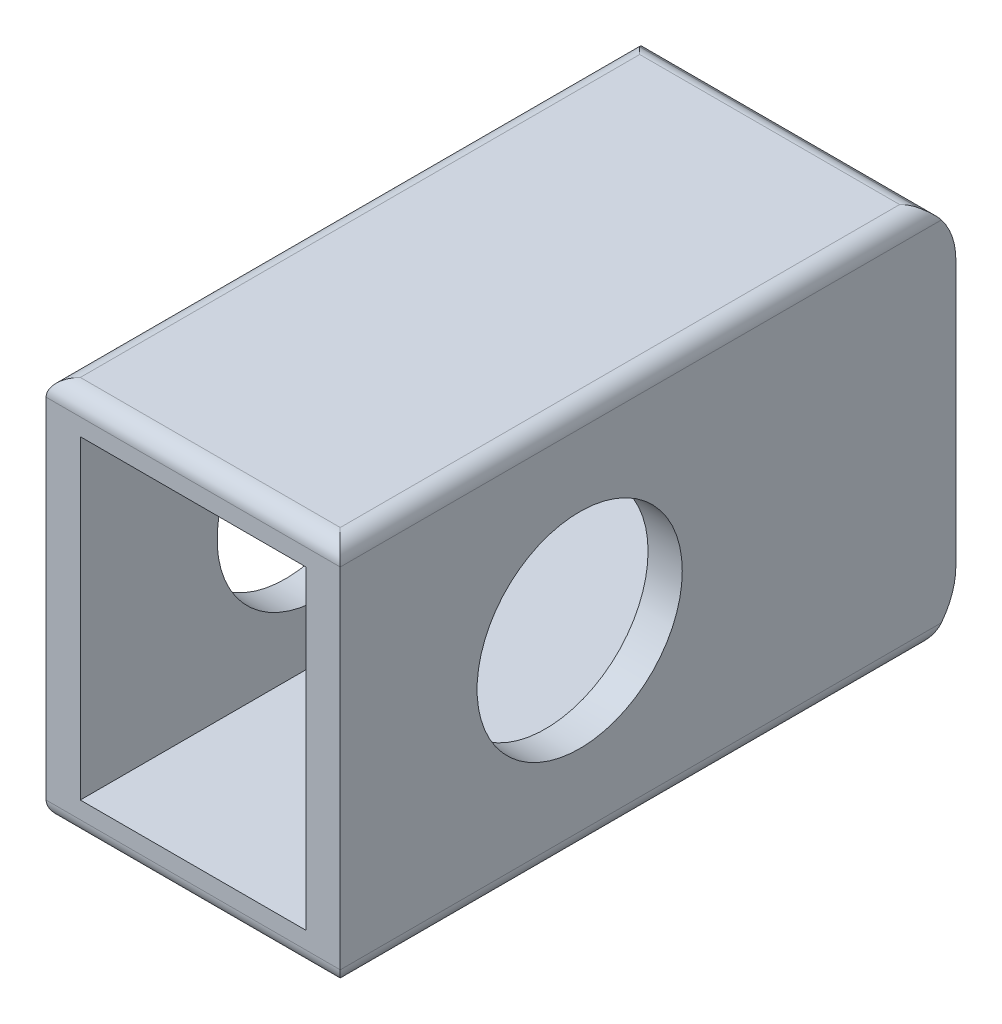
ISO-10303-21;
HEADER;
FILE_DESCRIPTION(('STEP AP214'),'2;1');
FILE_NAME('part.step','',(''),(''),'','','');
FILE_SCHEMA(('AUTOMOTIVE_DESIGN { 1 0 10303 214 1 1 1 1 }'));
ENDSEC;
DATA;
#1=APPLICATION_CONTEXT('core data for automotive mechanical design processes');
#2=APPLICATION_PROTOCOL_DEFINITION('international standard','automotive_design',2000,#1);
#3=PRODUCT_CONTEXT('',#1,'mechanical');
#4=PRODUCT('Part','Part','',(#3));
#5=PRODUCT_RELATED_PRODUCT_CATEGORY('part','',(#4));
#6=PRODUCT_DEFINITION_FORMATION('','',#4);
#7=PRODUCT_DEFINITION_CONTEXT('part definition',#1,'design');
#8=PRODUCT_DEFINITION('design','',#6,#7);
#9=PRODUCT_DEFINITION_SHAPE('','',#8);
#10=(LENGTH_UNIT() NAMED_UNIT(*) SI_UNIT(.MILLI.,.METRE.));
#11=(NAMED_UNIT(*) PLANE_ANGLE_UNIT() SI_UNIT($,.RADIAN.));
#12=(NAMED_UNIT(*) SI_UNIT($,.STERADIAN.) SOLID_ANGLE_UNIT());
#13=UNCERTAINTY_MEASURE_WITH_UNIT(LENGTH_MEASURE(1.E-05),#10,'distance_accuracy_value','');
#14=(GEOMETRIC_REPRESENTATION_CONTEXT(3) GLOBAL_UNCERTAINTY_ASSIGNED_CONTEXT((#13)) GLOBAL_UNIT_ASSIGNED_CONTEXT((#10,
#11,#12)) REPRESENTATION_CONTEXT('',''));
#15=CARTESIAN_POINT('',(0.,0.,0.));
#16=DIRECTION('',(0.,0.,1.));
#17=DIRECTION('',(1.,0.,0.));
#18=AXIS2_PLACEMENT_3D('',#15,#16,#17);
#19=CARTESIAN_POINT('',(-4.76811277750695,-7.26370150570095,18.));
#20=DIRECTION('',(1.,0.,0.));
#21=DIRECTION('',(0.,0.,-1.));
#22=AXIS2_PLACEMENT_3D('',#19,#20,#21);
#23=PLANE('',#22);
#24=CARTESIAN_POINT('',(-4.76811277750695,-1.66370150570095,11.));
#25=DIRECTION('',(1.,0.,0.));
#26=DIRECTION('',(0.,0.,-1.));
#27=AXIS2_PLACEMENT_3D('',#24,#25,#26);
#28=CIRCLE('',#27,3.);
#29=CARTESIAN_POINT('',(-4.76811277750695,-1.66370150570095,8.));
#30=VERTEX_POINT('',#29);
#31=EDGE_CURVE('E464',#30,#30,#28,.T.);
#32=ORIENTED_EDGE('',*,*,#31,.T.);
#33=EDGE_LOOP('',(#32));
#34=FACE_BOUND('',#33,.T.);
#35=CARTESIAN_POINT('',(-4.76811277750695,-5.53165069813207,2.));
#36=DIRECTION('',(1.,0.,0.));
#37=DIRECTION('',(0.,0.,-1.));
#38=AXIS2_PLACEMENT_3D('',#35,#36,#37);
#39=CIRCLE('',#38,2.);
#40=CARTESIAN_POINT('',(-4.76811277750695,-5.53165069813207,0.));
#41=VERTEX_POINT('',#40);
#42=CARTESIAN_POINT('',(-4.76811277750695,-6.76370150570095,0.424547427699308));
#43=VERTEX_POINT('',#42);
#44=EDGE_CURVE('E163',#41,#43,#39,.F.);
#45=ORIENTED_EDGE('',*,*,#44,.T.);
#46=DIRECTION('',(0.,0.,-1.));
#47=VECTOR('',#46,1.);
#48=CARTESIAN_POINT('',(-4.76811277750695,-6.76370150570095,18.));
#49=LINE('',#48,#47);
#50=CARTESIAN_POINT('',(-4.76811277750695,-6.76370150570095,18.));
#51=VERTEX_POINT('',#50);
#52=EDGE_CURVE('E450',#43,#51,#49,.F.);
#53=ORIENTED_EDGE('',*,*,#52,.T.);
#54=DIRECTION('',(0.,-1.,0.));
#55=VECTOR('',#54,1.);
#56=CARTESIAN_POINT('',(-4.76811277750695,-7.26370150570095,18.));
#57=LINE('',#56,#55);
#58=CARTESIAN_POINT('',(-4.76811277750695,3.43629849429905,18.));
#59=VERTEX_POINT('',#58);
#60=EDGE_CURVE('E187',#59,#51,#57,.T.);
#61=ORIENTED_EDGE('',*,*,#60,.F.);
#62=DIRECTION('',(0.,0.,-1.));
#63=VECTOR('',#62,1.);
#64=CARTESIAN_POINT('',(-4.76811277750695,3.43629849429905,18.));
#65=LINE('',#64,#63);
#66=CARTESIAN_POINT('',(-4.76811277750695,3.43629849429905,0.424547427699308));
#67=VERTEX_POINT('',#66);
#68=EDGE_CURVE('E263',#59,#67,#65,.T.);
#69=ORIENTED_EDGE('',*,*,#68,.T.);
#70=CARTESIAN_POINT('',(-4.76811277750695,2.20424768673017,2.));
#71=DIRECTION('',(1.,0.,0.));
#72=DIRECTION('',(0.,0.,-1.));
#73=AXIS2_PLACEMENT_3D('',#70,#71,#72);
#74=CIRCLE('',#73,2.);
#75=CARTESIAN_POINT('',(-4.76811277750695,2.20424768673017,0.));
#76=VERTEX_POINT('',#75);
#77=EDGE_CURVE('E328',#76,#67,#74,.T.);
#78=ORIENTED_EDGE('',*,*,#77,.F.);
#79=DIRECTION('',(0.,-1.,0.));
#80=VECTOR('',#79,1.);
#81=CARTESIAN_POINT('',(-4.76811277750695,-7.26370150570095,0.));
#82=LINE('',#81,#80);
#83=EDGE_CURVE('E188',#76,#41,#82,.T.);
#84=ORIENTED_EDGE('',*,*,#83,.T.);
#85=EDGE_LOOP('',(#45,#53,#61,#69,#78,#84));
#86=FACE_BOUND('',#85,.T.);
#87=ADVANCED_FACE('F42',(#34,#86),#23,.F.);
#88=CARTESIAN_POINT('',(3.83188722249305,-7.26370150570095,18.));
#89=DIRECTION('',(-1.,0.,0.));
#90=DIRECTION('',(0.,0.,1.));
#91=AXIS2_PLACEMENT_3D('',#88,#89,#90);
#92=PLANE('',#91);
#93=CARTESIAN_POINT('',(3.83188722249305,-1.66370150570095,11.));
#94=DIRECTION('',(1.,0.,0.));
#95=DIRECTION('',(0.,0.,-1.));
#96=AXIS2_PLACEMENT_3D('',#93,#94,#95);
#97=CIRCLE('',#96,3.);
#98=CARTESIAN_POINT('',(3.83188722249305,-1.66370150570095,8.));
#99=VERTEX_POINT('',#98);
#100=EDGE_CURVE('E182',#99,#99,#97,.T.);
#101=ORIENTED_EDGE('',*,*,#100,.F.);
#102=EDGE_LOOP('',(#101));
#103=FACE_BOUND('',#102,.T.);
#104=DIRECTION('',(0.,1.,0.));
#105=VECTOR('',#104,1.);
#106=CARTESIAN_POINT('',(3.83188722249305,-7.26370150570095,18.));
#107=LINE('',#106,#105);
#108=CARTESIAN_POINT('',(3.83188722249305,-6.76370150570095,18.));
#109=VERTEX_POINT('',#108);
#110=CARTESIAN_POINT('',(3.83188722249305,3.43629849429905,18.));
#111=VERTEX_POINT('',#110);
#112=EDGE_CURVE('E170',#109,#111,#107,.T.);
#113=ORIENTED_EDGE('',*,*,#112,.F.);
#114=DIRECTION('',(0.,0.,-1.));
#115=VECTOR('',#114,1.);
#116=CARTESIAN_POINT('',(3.83188722249305,-6.76370150570095,18.));
#117=LINE('',#116,#115);
#118=CARTESIAN_POINT('',(3.83188722249305,-6.76370150570095,0.424547427699308));
#119=VERTEX_POINT('',#118);
#120=EDGE_CURVE('E179',#109,#119,#117,.T.);
#121=ORIENTED_EDGE('',*,*,#120,.T.);
#122=CARTESIAN_POINT('',(3.83188722249305,-5.53165069813207,2.));
#123=DIRECTION('',(1.,0.,0.));
#124=DIRECTION('',(0.,0.,-1.));
#125=AXIS2_PLACEMENT_3D('',#122,#123,#124);
#126=CIRCLE('',#125,2.);
#127=CARTESIAN_POINT('',(3.83188722249305,-5.53165069813207,0.));
#128=VERTEX_POINT('',#127);
#129=EDGE_CURVE('E160',#128,#119,#126,.F.);
#130=ORIENTED_EDGE('',*,*,#129,.F.);
#131=DIRECTION('',(0.,1.,0.));
#132=VECTOR('',#131,1.);
#133=CARTESIAN_POINT('',(3.83188722249305,-7.26370150570095,0.));
#134=LINE('',#133,#132);
#135=CARTESIAN_POINT('',(3.83188722249305,2.20424768673017,0.));
#136=VERTEX_POINT('',#135);
#137=EDGE_CURVE('E177',#128,#136,#134,.T.);
#138=ORIENTED_EDGE('',*,*,#137,.T.);
#139=CARTESIAN_POINT('',(3.83188722249305,2.20424768673017,2.));
#140=DIRECTION('',(1.,0.,0.));
#141=DIRECTION('',(0.,0.,-1.));
#142=AXIS2_PLACEMENT_3D('',#139,#140,#141);
#143=CIRCLE('',#142,2.);
#144=CARTESIAN_POINT('',(3.83188722249305,3.43629849429905,0.424547427699308));
#145=VERTEX_POINT('',#144);
#146=EDGE_CURVE('E181',#136,#145,#143,.T.);
#147=ORIENTED_EDGE('',*,*,#146,.T.);
#148=DIRECTION('',(0.,0.,-1.));
#149=VECTOR('',#148,1.);
#150=CARTESIAN_POINT('',(3.83188722249305,3.43629849429905,18.));
#151=LINE('',#150,#149);
#152=EDGE_CURVE('E225',#145,#111,#151,.F.);
#153=ORIENTED_EDGE('',*,*,#152,.T.);
#154=EDGE_LOOP('',(#113,#121,#130,#138,#147,#153));
#155=FACE_BOUND('',#154,.T.);
#156=ADVANCED_FACE('F175',(#103,#155),#92,.F.);
#157=CARTESIAN_POINT('',(-4.76811277750695,3.93629849429905,18.));
#158=DIRECTION('',(0.,-1.,0.));
#159=DIRECTION('',(0.,0.,-1.));
#160=AXIS2_PLACEMENT_3D('',#157,#158,#159);
#161=PLANE('',#160);
#162=DIRECTION('',(-1.,0.,0.));
#163=VECTOR('',#162,1.);
#164=CARTESIAN_POINT('',(-4.76811277750695,3.93629849429905,17.5));
#165=LINE('',#164,#163);
#166=CARTESIAN_POINT('',(-4.26811277750695,3.93629849429905,17.5));
#167=VERTEX_POINT('',#166);
#168=CARTESIAN_POINT('',(3.33188722249305,3.93629849429905,17.5));
#169=VERTEX_POINT('',#168);
#170=EDGE_CURVE('E390',#167,#169,#165,.F.);
#171=ORIENTED_EDGE('',*,*,#170,.T.);
#172=DIRECTION('',(0.,0.,-1.));
#173=VECTOR('',#172,1.);
#174=CARTESIAN_POINT('',(3.33188722249305,3.93629849429905,18.));
#175=LINE('',#174,#173);
#176=CARTESIAN_POINT('',(3.33188722249305,3.93629849429905,1.14440032283265));
#177=VERTEX_POINT('',#176);
#178=EDGE_CURVE('E380',#169,#177,#175,.T.);
#179=ORIENTED_EDGE('',*,*,#178,.T.);
#180=DIRECTION('',(-1.,0.,0.));
#181=VECTOR('',#180,1.);
#182=CARTESIAN_POINT('',(-4.76811277750695,3.93629849429905,1.14440032283265));
#183=LINE('',#182,#181);
#184=CARTESIAN_POINT('',(-4.26811277750695,3.93629849429905,1.14440032283265));
#185=VERTEX_POINT('',#184);
#186=EDGE_CURVE('E448',#177,#185,#183,.T.);
#187=ORIENTED_EDGE('',*,*,#186,.T.);
#188=DIRECTION('',(0.,0.,-1.));
#189=VECTOR('',#188,1.);
#190=CARTESIAN_POINT('',(-4.26811277750695,3.93629849429905,18.));
#191=LINE('',#190,#189);
#192=EDGE_CURVE('E445',#185,#167,#191,.F.);
#193=ORIENTED_EDGE('',*,*,#192,.T.);
#194=EDGE_LOOP('',(#171,#179,#187,#193));
#195=FACE_BOUND('',#194,.T.);
#196=ADVANCED_FACE('F285',(#195),#161,.F.);
#197=CARTESIAN_POINT('',(0.,0.,0.));
#198=DIRECTION('',(0.,0.,-1.));
#199=DIRECTION('',(-1.,0.,0.));
#200=AXIS2_PLACEMENT_3D('',#197,#198,#199);
#201=PLANE('',#200);
#202=ORIENTED_EDGE('',*,*,#83,.F.);
#203=DIRECTION('',(1.,0.,0.));
#204=VECTOR('',#203,1.);
#205=CARTESIAN_POINT('',(-16.1681127775069,2.20424768673017,0.));
#206=LINE('',#205,#204);
#207=EDGE_CURVE('E169',#76,#136,#206,.T.);
#208=ORIENTED_EDGE('',*,*,#207,.T.);
#209=ORIENTED_EDGE('',*,*,#137,.F.);
#210=DIRECTION('',(1.,0.,0.));
#211=VECTOR('',#210,1.);
#212=CARTESIAN_POINT('',(-16.1681127775069,-5.53165069813207,0.));
#213=LINE('',#212,#211);
#214=EDGE_CURVE('E157',#128,#41,#213,.F.);
#215=ORIENTED_EDGE('',*,*,#214,.T.);
#216=EDGE_LOOP('',(#202,#208,#209,#215));
#217=FACE_BOUND('',#216,.T.);
#218=ADVANCED_FACE('F185',(#217),#201,.T.);
#219=CARTESIAN_POINT('',(0.,0.,18.));
#220=DIRECTION('',(0.,0.,-1.));
#221=DIRECTION('',(-1.,0.,0.));
#222=AXIS2_PLACEMENT_3D('',#219,#220,#221);
#223=PLANE('',#222);
#224=ORIENTED_EDGE('',*,*,#60,.T.);
#225=DIRECTION('',(1.,0.,0.));
#226=VECTOR('',#225,1.);
#227=CARTESIAN_POINT('',(0.,-6.76370150570095,18.));
#228=LINE('',#227,#226);
#229=EDGE_CURVE('E208',#51,#109,#228,.T.);
#230=ORIENTED_EDGE('',*,*,#229,.T.);
#231=ORIENTED_EDGE('',*,*,#112,.T.);
#232=DIRECTION('',(-1.,0.,0.));
#233=VECTOR('',#232,1.);
#234=CARTESIAN_POINT('',(0.,3.43629849429905,18.));
#235=LINE('',#234,#233);
#236=EDGE_CURVE('E205',#111,#59,#235,.T.);
#237=ORIENTED_EDGE('',*,*,#236,.T.);
#238=EDGE_LOOP('',(#224,#230,#231,#237));
#239=FACE_BOUND('',#238,.T.);
#240=DIRECTION('',(0.,-1.,0.));
#241=VECTOR('',#240,1.);
#242=CARTESIAN_POINT('',(-3.76811277750695,0.,18.));
#243=LINE('',#242,#241);
#244=CARTESIAN_POINT('',(-3.76811277750695,2.93629849429905,18.));
#245=VERTEX_POINT('',#244);
#246=CARTESIAN_POINT('',(-3.76811277750695,-6.26370150570095,18.));
#247=VERTEX_POINT('',#246);
#248=EDGE_CURVE('E355',#245,#247,#243,.T.);
#249=ORIENTED_EDGE('',*,*,#248,.F.);
#250=DIRECTION('',(-1.,0.,0.));
#251=VECTOR('',#250,1.);
#252=CARTESIAN_POINT('',(0.,2.93629849429905,18.));
#253=LINE('',#252,#251);
#254=CARTESIAN_POINT('',(2.83188722249305,2.93629849429905,18.));
#255=VERTEX_POINT('',#254);
#256=EDGE_CURVE('E342',#255,#245,#253,.T.);
#257=ORIENTED_EDGE('',*,*,#256,.F.);
#258=DIRECTION('',(0.,1.,0.));
#259=VECTOR('',#258,1.);
#260=CARTESIAN_POINT('',(2.83188722249305,0.,18.));
#261=LINE('',#260,#259);
#262=CARTESIAN_POINT('',(2.83188722249305,-6.26370150570095,18.));
#263=VERTEX_POINT('',#262);
#264=EDGE_CURVE('E361',#263,#255,#261,.T.);
#265=ORIENTED_EDGE('',*,*,#264,.F.);
#266=DIRECTION('',(1.,0.,0.));
#267=VECTOR('',#266,1.);
#268=CARTESIAN_POINT('',(0.,-6.26370150570095,18.));
#269=LINE('',#268,#267);
#270=EDGE_CURVE('E358',#247,#263,#269,.T.);
#271=ORIENTED_EDGE('',*,*,#270,.F.);
#272=EDGE_LOOP('',(#249,#257,#265,#271));
#273=FACE_BOUND('',#272,.T.);
#274=ADVANCED_FACE('F281',(#239,#273),#223,.F.);
#275=CARTESIAN_POINT('',(-4.76811277750695,-7.26370150570095,18.));
#276=DIRECTION('',(0.,1.,0.));
#277=DIRECTION('',(0.,0.,1.));
#278=AXIS2_PLACEMENT_3D('',#275,#276,#277);
#279=PLANE('',#278);
#280=DIRECTION('',(0.,0.,-1.));
#281=VECTOR('',#280,1.);
#282=CARTESIAN_POINT('',(3.33188722249305,-7.26370150570095,18.));
#283=LINE('',#282,#281);
#284=CARTESIAN_POINT('',(3.33188722249305,-7.26370150570095,1.14440032283265));
#285=VERTEX_POINT('',#284);
#286=CARTESIAN_POINT('',(3.33188722249305,-7.26370150570095,17.5));
#287=VERTEX_POINT('',#286);
#288=EDGE_CURVE('E218',#285,#287,#283,.F.);
#289=ORIENTED_EDGE('',*,*,#288,.T.);
#290=DIRECTION('',(1.,0.,0.));
#291=VECTOR('',#290,1.);
#292=CARTESIAN_POINT('',(-4.76811277750695,-7.26370150570095,17.5));
#293=LINE('',#292,#291);
#294=CARTESIAN_POINT('',(-4.26811277750695,-7.26370150570095,17.5));
#295=VERTEX_POINT('',#294);
#296=EDGE_CURVE('E221',#287,#295,#293,.F.);
#297=ORIENTED_EDGE('',*,*,#296,.T.);
#298=DIRECTION('',(0.,0.,-1.));
#299=VECTOR('',#298,1.);
#300=CARTESIAN_POINT('',(-4.26811277750695,-7.26370150570095,18.));
#301=LINE('',#300,#299);
#302=CARTESIAN_POINT('',(-4.26811277750695,-7.26370150570095,1.14440032283265));
#303=VERTEX_POINT('',#302);
#304=EDGE_CURVE('E212',#295,#303,#301,.T.);
#305=ORIENTED_EDGE('',*,*,#304,.T.);
#306=DIRECTION('',(1.,0.,0.));
#307=VECTOR('',#306,1.);
#308=CARTESIAN_POINT('',(-4.76811277750695,-7.26370150570095,1.14440032283265));
#309=LINE('',#308,#307);
#310=EDGE_CURVE('E215',#303,#285,#309,.T.);
#311=ORIENTED_EDGE('',*,*,#310,.T.);
#312=EDGE_LOOP('',(#289,#297,#305,#311));
#313=FACE_BOUND('',#312,.T.);
#314=ADVANCED_FACE('F277',(#313),#279,.F.);
#315=CARTESIAN_POINT('',(-3.76811277750695,-7.26370150570095,18.));
#316=DIRECTION('',(1.,0.,0.));
#317=DIRECTION('',(0.,0.,-1.));
#318=AXIS2_PLACEMENT_3D('',#315,#316,#317);
#319=PLANE('',#318);
#320=CARTESIAN_POINT('',(-3.76811277750695,-1.66370150570095,11.));
#321=DIRECTION('',(1.,0.,0.));
#322=DIRECTION('',(0.,0.,-1.));
#323=AXIS2_PLACEMENT_3D('',#320,#321,#322);
#324=CIRCLE('',#323,3.);
#325=CARTESIAN_POINT('',(-3.76811277750695,-1.66370150570095,8.));
#326=VERTEX_POINT('',#325);
#327=EDGE_CURVE('E201',#326,#326,#324,.T.);
#328=ORIENTED_EDGE('',*,*,#327,.F.);
#329=EDGE_LOOP('',(#328));
#330=FACE_BOUND('',#329,.T.);
#331=DIRECTION('',(0.,-1.,0.));
#332=VECTOR('',#331,1.);
#333=CARTESIAN_POINT('',(-3.76811277750695,0.,1.));
#334=LINE('',#333,#332);
#335=CARTESIAN_POINT('',(-3.76811277750695,2.93629849429905,1.));
#336=VERTEX_POINT('',#335);
#337=CARTESIAN_POINT('',(-3.76811277750695,-6.26370150570095,1.));
#338=VERTEX_POINT('',#337);
#339=EDGE_CURVE('E321',#336,#338,#334,.T.);
#340=ORIENTED_EDGE('',*,*,#339,.F.);
#341=DIRECTION('',(0.,0.,-1.));
#342=VECTOR('',#341,1.);
#343=CARTESIAN_POINT('',(-3.76811277750695,2.93629849429905,18.));
#344=LINE('',#343,#342);
#345=EDGE_CURVE('E323',#245,#336,#344,.T.);
#346=ORIENTED_EDGE('',*,*,#345,.F.);
#347=ORIENTED_EDGE('',*,*,#248,.T.);
#348=DIRECTION('',(0.,0.,-1.));
#349=VECTOR('',#348,1.);
#350=CARTESIAN_POINT('',(-3.76811277750695,-6.26370150570095,18.));
#351=LINE('',#350,#349);
#352=EDGE_CURVE('E194',#247,#338,#351,.T.);
#353=ORIENTED_EDGE('',*,*,#352,.T.);
#354=EDGE_LOOP('',(#340,#346,#347,#353));
#355=FACE_BOUND('',#354,.T.);
#356=ADVANCED_FACE('F280',(#330,#355),#319,.T.);
#357=CARTESIAN_POINT('',(-4.76811277750695,-6.26370150570095,18.));
#358=DIRECTION('',(0.,1.,0.));
#359=DIRECTION('',(0.,0.,1.));
#360=AXIS2_PLACEMENT_3D('',#357,#358,#359);
#361=PLANE('',#360);
#362=DIRECTION('',(1.,0.,0.));
#363=VECTOR('',#362,1.);
#364=CARTESIAN_POINT('',(0.,-6.26370150570095,1.));
#365=LINE('',#364,#363);
#366=CARTESIAN_POINT('',(2.83188722249305,-6.26370150570095,1.));
#367=VERTEX_POINT('',#366);
#368=EDGE_CURVE('E327',#338,#367,#365,.T.);
#369=ORIENTED_EDGE('',*,*,#368,.F.);
#370=ORIENTED_EDGE('',*,*,#352,.F.);
#371=ORIENTED_EDGE('',*,*,#270,.T.);
#372=DIRECTION('',(0.,0.,-1.));
#373=VECTOR('',#372,1.);
#374=CARTESIAN_POINT('',(2.83188722249305,-6.26370150570095,18.));
#375=LINE('',#374,#373);
#376=EDGE_CURVE('E339',#263,#367,#375,.T.);
#377=ORIENTED_EDGE('',*,*,#376,.T.);
#378=EDGE_LOOP('',(#369,#370,#371,#377));
#379=FACE_BOUND('',#378,.T.);
#380=ADVANCED_FACE('F306',(#379),#361,.T.);
#381=CARTESIAN_POINT('',(2.83188722249305,-7.26370150570095,18.));
#382=DIRECTION('',(-1.,0.,0.));
#383=DIRECTION('',(0.,0.,1.));
#384=AXIS2_PLACEMENT_3D('',#381,#382,#383);
#385=PLANE('',#384);
#386=CARTESIAN_POINT('',(2.83188722249305,-1.66370150570095,11.));
#387=DIRECTION('',(-1.,0.,0.));
#388=DIRECTION('',(0.,0.,1.));
#389=AXIS2_PLACEMENT_3D('',#386,#387,#388);
#390=CIRCLE('',#389,3.);
#391=CARTESIAN_POINT('',(2.83188722249305,-1.66370150570095,14.));
#392=VERTEX_POINT('',#391);
#393=EDGE_CURVE('E198',#392,#392,#390,.T.);
#394=ORIENTED_EDGE('',*,*,#393,.F.);
#395=EDGE_LOOP('',(#394));
#396=FACE_BOUND('',#395,.T.);
#397=DIRECTION('',(0.,1.,0.));
#398=VECTOR('',#397,1.);
#399=CARTESIAN_POINT('',(2.83188722249305,0.,1.));
#400=LINE('',#399,#398);
#401=CARTESIAN_POINT('',(2.83188722249305,2.93629849429905,1.));
#402=VERTEX_POINT('',#401);
#403=EDGE_CURVE('E332',#367,#402,#400,.T.);
#404=ORIENTED_EDGE('',*,*,#403,.F.);
#405=ORIENTED_EDGE('',*,*,#376,.F.);
#406=ORIENTED_EDGE('',*,*,#264,.T.);
#407=DIRECTION('',(0.,0.,-1.));
#408=VECTOR('',#407,1.);
#409=CARTESIAN_POINT('',(2.83188722249305,2.93629849429905,18.));
#410=LINE('',#409,#408);
#411=EDGE_CURVE('E341',#255,#402,#410,.T.);
#412=ORIENTED_EDGE('',*,*,#411,.T.);
#413=EDGE_LOOP('',(#404,#405,#406,#412));
#414=FACE_BOUND('',#413,.T.);
#415=ADVANCED_FACE('F302',(#396,#414),#385,.T.);
#416=CARTESIAN_POINT('',(-4.76811277750695,2.93629849429905,18.));
#417=DIRECTION('',(0.,-1.,0.));
#418=DIRECTION('',(0.,0.,-1.));
#419=AXIS2_PLACEMENT_3D('',#416,#417,#418);
#420=PLANE('',#419);
#421=DIRECTION('',(-1.,0.,0.));
#422=VECTOR('',#421,1.);
#423=CARTESIAN_POINT('',(0.,2.93629849429905,1.));
#424=LINE('',#423,#422);
#425=EDGE_CURVE('E349',#402,#336,#424,.T.);
#426=ORIENTED_EDGE('',*,*,#425,.F.);
#427=ORIENTED_EDGE('',*,*,#411,.F.);
#428=ORIENTED_EDGE('',*,*,#256,.T.);
#429=ORIENTED_EDGE('',*,*,#345,.T.);
#430=EDGE_LOOP('',(#426,#427,#428,#429));
#431=FACE_BOUND('',#430,.T.);
#432=ADVANCED_FACE('F298',(#431),#420,.T.);
#433=CARTESIAN_POINT('',(0.,0.,1.));
#434=DIRECTION('',(0.,0.,-1.));
#435=DIRECTION('',(-1.,0.,0.));
#436=AXIS2_PLACEMENT_3D('',#433,#434,#435);
#437=PLANE('',#436);
#438=ORIENTED_EDGE('',*,*,#339,.T.);
#439=ORIENTED_EDGE('',*,*,#368,.T.);
#440=ORIENTED_EDGE('',*,*,#403,.T.);
#441=ORIENTED_EDGE('',*,*,#425,.T.);
#442=EDGE_LOOP('',(#438,#439,#440,#441));
#443=FACE_BOUND('',#442,.T.);
#444=ADVANCED_FACE('F295',(#443),#437,.F.);
#445=CARTESIAN_POINT('',(-16.1681127775069,-1.66370150570095,11.));
#446=DIRECTION('',(1.,0.,0.));
#447=DIRECTION('',(0.,0.,-1.));
#448=AXIS2_PLACEMENT_3D('',#445,#446,#447);
#449=CYLINDRICAL_SURFACE('',#448,3.);
#450=ORIENTED_EDGE('',*,*,#393,.T.);
#451=EDGE_LOOP('',(#450));
#452=FACE_BOUND('',#451,.T.);
#453=ORIENTED_EDGE('',*,*,#100,.T.);
#454=EDGE_LOOP('',(#453));
#455=FACE_BOUND('',#454,.T.);
#456=ADVANCED_FACE('F253',(#452,#455),#449,.F.);
#457=ORIENTED_EDGE('',*,*,#327,.T.);
#458=EDGE_LOOP('',(#457));
#459=FACE_BOUND('',#458,.T.);
#460=ORIENTED_EDGE('',*,*,#31,.F.);
#461=EDGE_LOOP('',(#460));
#462=FACE_BOUND('',#461,.T.);
#463=ADVANCED_FACE('F251',(#459,#462),#449,.F.);
#464=CARTESIAN_POINT('',(-16.1681127775069,-5.53165069813207,2.));
#465=DIRECTION('',(1.,0.,0.));
#466=DIRECTION('',(0.,0.,-1.));
#467=AXIS2_PLACEMENT_3D('',#464,#465,#466);
#468=CYLINDRICAL_SURFACE('',#467,2.);
#469=ORIENTED_EDGE('',*,*,#129,.T.);
#470=CARTESIAN_POINT('',(3.83188722249305,-6.76370150570095,0.424547427699309));
#471=CARTESIAN_POINT('',(3.83184386015346,-6.79711497552626,0.450640214328507));
#472=CARTESIAN_POINT('',(3.82854451366882,-6.82956881895408,0.477767053474967));
#473=CARTESIAN_POINT('',(3.81617060443482,-6.89214171456879,0.533443759822761));
#474=CARTESIAN_POINT('',(3.80709088465805,-6.92225865491544,0.561994876725386));
#475=CARTESIAN_POINT('',(3.7826690831288,-6.98271756174039,0.622884315579442));
#476=CARTESIAN_POINT('',(3.76676622825469,-7.01274642968924,0.655303810576133));
#477=CARTESIAN_POINT('',(3.72926264961764,-7.06905044380729,0.720065723965875));
#478=CARTESIAN_POINT('',(3.70766932676286,-7.09533039780371,0.752408187810209));
#479=CARTESIAN_POINT('',(3.67314963160284,-7.12940104404108,0.79689599017413));
#480=CARTESIAN_POINT('',(3.66266993911848,-7.13891985202114,0.809652625966286));
#481=CARTESIAN_POINT('',(3.64067521634823,-7.15721543360905,0.834761450603082));
#482=CARTESIAN_POINT('',(3.62916149300307,-7.16599311744669,0.847114123808405));
#483=CARTESIAN_POINT('',(3.61708711488226,-7.17438510822385,0.859200430443448));
#484=B_SPLINE_CURVE_WITH_KNOTS('',3,(#470,#471,#472,#473,#474,#475,#476,#477,#478,#479,#480,
#481,#482,#483),.UNSPECIFIED.,.F.,.F.,(4,2,2,2,2,2,4),(0.,0.126867182188873,0.253847709334877,
0.39425839886421,0.534487366684648,0.591619260150159,0.648679932831876),.UNSPECIFIED.);
#485=CARTESIAN_POINT('',(3.61708711488243,-7.17438510822391,0.859200430443539));
#486=VERTEX_POINT('',#485);
#487=EDGE_CURVE('E256',#119,#486,#484,.T.);
#488=ORIENTED_EDGE('',*,*,#487,.T.);
#489=DIRECTION('',(1.,0.,0.));
#490=VECTOR('',#489,1.);
#491=CARTESIAN_POINT('',(-16.1681127775069,-7.17438510822391,0.859200430443539));
#492=LINE('',#491,#490);
#493=CARTESIAN_POINT('',(-4.55331266989634,-7.17438510822391,0.859200430443539));
#494=VERTEX_POINT('',#493);
#495=EDGE_CURVE('E240',#486,#494,#492,.F.);
#496=ORIENTED_EDGE('',*,*,#495,.T.);
#497=CARTESIAN_POINT('',(-4.55331266989634,-7.17438510822391,0.859200430443539));
#498=CARTESIAN_POINT('',(-4.56670616738766,-7.16507293740131,0.845787143689493));
#499=CARTESIAN_POINT('',(-4.57941497428572,-7.15528693671196,0.832050045418621));
#500=CARTESIAN_POINT('',(-4.60354317744842,-7.13483289308993,0.804130418230282));
#501=CARTESIAN_POINT('',(-4.6149636048353,-7.12416556752087,0.789948257295803));
#502=CARTESIAN_POINT('',(-4.64753974099085,-7.0908167942635,0.746875221685913));
#503=CARTESIAN_POINT('',(-4.66689189249621,-7.06687296728508,0.717581358574029));
#504=CARTESIAN_POINT('',(-4.70361733667195,-7.01188705081819,0.654292243878504));
#505=CARTESIAN_POINT('',(-4.72018915235616,-6.98032151102249,0.620288687796437));
#506=CARTESIAN_POINT('',(-4.7464848854571,-6.91350428885593,0.553383009687379));
#507=CARTESIAN_POINT('',(-4.7562300052687,-6.87826441352484,0.520477782418591));
#508=CARTESIAN_POINT('',(-4.76401024970749,-6.8288889554554,0.477680797321232));
#509=CARTESIAN_POINT('',(-4.76553379220303,-6.81606605327313,0.466846178576774));
#510=CARTESIAN_POINT('',(-4.76758442412061,-6.79010894174184,0.445469598360095));
#511=CARTESIAN_POINT('',(-4.76811186464703,-6.77697484373609,0.434927535059862));
#512=CARTESIAN_POINT('',(-4.76811277750725,-6.76370150570104,0.42454742769927));
#513=B_SPLINE_CURVE_WITH_KNOTS('',3,(#497,#498,#499,#500,#501,#502,#503,#504,#505,#506,#507,
#508,#509,#510,#511,#512),.UNSPECIFIED.,.F.,.F.,(4,2,2,2,2,2,2,4),(0.,0.0633069187697686,
0.126562806507097,0.253641680135269,0.400888515550436,0.547675978631611,0.598216974821131,
0.648740153076502),.UNSPECIFIED.);
#514=EDGE_CURVE('E231',#494,#43,#513,.T.);
#515=ORIENTED_EDGE('',*,*,#514,.T.);
#516=ORIENTED_EDGE('',*,*,#44,.F.);
#517=ORIENTED_EDGE('',*,*,#214,.F.);
#518=EDGE_LOOP('',(#469,#488,#496,#515,#516,#517));
#519=FACE_BOUND('',#518,.T.);
#520=ADVANCED_FACE('F159',(#519),#468,.T.);
#521=CARTESIAN_POINT('',(-16.1681127775069,2.20424768673017,2.));
#522=DIRECTION('',(1.,0.,0.));
#523=DIRECTION('',(0.,0.,-1.));
#524=AXIS2_PLACEMENT_3D('',#521,#522,#523);
#525=CYLINDRICAL_SURFACE('',#524,2.);
#526=DIRECTION('',(1.,0.,0.));
#527=VECTOR('',#526,1.);
#528=CARTESIAN_POINT('',(-16.1681127775069,3.84698209682201,0.859200430443537));
#529=LINE('',#528,#527);
#530=CARTESIAN_POINT('',(-4.55331266989634,3.84698209682201,0.859200430443537));
#531=VERTEX_POINT('',#530);
#532=CARTESIAN_POINT('',(3.61708711488243,3.84698209682201,0.859200430443537));
#533=VERTEX_POINT('',#532);
#534=EDGE_CURVE('E60',#531,#533,#529,.T.);
#535=ORIENTED_EDGE('',*,*,#534,.T.);
#536=CARTESIAN_POINT('',(3.61708711488244,3.84698209682201,0.859200430443537));
#537=CARTESIAN_POINT('',(3.63048061237376,3.8376699259994,0.845787143689492));
#538=CARTESIAN_POINT('',(3.64318941927182,3.82788392531005,0.83205004541862));
#539=CARTESIAN_POINT('',(3.66731762243452,3.80742988168803,0.804130418230281));
#540=CARTESIAN_POINT('',(3.6787380498214,3.79676255611896,0.789948257295802));
#541=CARTESIAN_POINT('',(3.71131418597695,3.76341378286159,0.746875221685912));
#542=CARTESIAN_POINT('',(3.73066633748231,3.73946995588317,0.717581358574028));
#543=CARTESIAN_POINT('',(3.76739178165805,3.68448403941628,0.654292243878503));
#544=CARTESIAN_POINT('',(3.78396359734226,3.65291849962058,0.620288687796435));
#545=CARTESIAN_POINT('',(3.8102593304432,3.58610127745402,0.553383009687377));
#546=CARTESIAN_POINT('',(3.8200044502548,3.55086140212293,0.520477782418589));
#547=CARTESIAN_POINT('',(3.82778469469359,3.5014859440535,0.477680797321231));
#548=CARTESIAN_POINT('',(3.82930823718913,3.48866304187122,0.466846178576774));
#549=CARTESIAN_POINT('',(3.83135886910671,3.46270593033993,0.445469598360094));
#550=CARTESIAN_POINT('',(3.83188630963313,3.44957183233418,0.434927535059861));
#551=CARTESIAN_POINT('',(3.83188722249335,3.43629849429913,0.424547427699269));
#552=B_SPLINE_CURVE_WITH_KNOTS('',3,(#536,#537,#538,#539,#540,#541,#542,#543,#544,#545,#546,
#547,#548,#549,#550,#551),.UNSPECIFIED.,.F.,.F.,(4,2,2,2,2,2,2,4),(0.,0.0633069187697681,
0.126562806507096,0.253641680135269,0.400888515550437,0.547675978631611,0.59821697482113,
0.648740153076501),.UNSPECIFIED.);
#553=EDGE_CURVE('E12',#533,#145,#552,.T.);
#554=ORIENTED_EDGE('',*,*,#553,.T.);
#555=ORIENTED_EDGE('',*,*,#146,.F.);
#556=ORIENTED_EDGE('',*,*,#207,.F.);
#557=ORIENTED_EDGE('',*,*,#77,.T.);
#558=CARTESIAN_POINT('',(-4.76811277750695,3.43629849429905,0.424547427699308));
#559=CARTESIAN_POINT('',(-4.76806941516736,3.46971196412435,0.450640214328506));
#560=CARTESIAN_POINT('',(-4.76477006868272,3.50216580755217,0.477767053474966));
#561=CARTESIAN_POINT('',(-4.75239615944872,3.56473870316688,0.533443759822759));
#562=CARTESIAN_POINT('',(-4.74331643967196,3.59485564351353,0.561994876725384));
#563=CARTESIAN_POINT('',(-4.7188946381427,3.65531455033848,0.622884315579441));
#564=CARTESIAN_POINT('',(-4.70299178326859,3.68534341828734,0.655303810576132));
#565=CARTESIAN_POINT('',(-4.66548820463154,3.74164743240539,0.720065723965874));
#566=CARTESIAN_POINT('',(-4.64389488177676,3.7679273864018,0.752408187810207));
#567=CARTESIAN_POINT('',(-4.60937518661674,3.80199803263917,0.796895990174128));
#568=CARTESIAN_POINT('',(-4.59889549413238,3.81151684061923,0.809652625966284));
#569=CARTESIAN_POINT('',(-4.57690077136213,3.82981242220714,0.834761450603079));
#570=CARTESIAN_POINT('',(-4.56538704801696,3.83859010604478,0.847114123808404));
#571=CARTESIAN_POINT('',(-4.55331266989616,3.84698209682194,0.859200430443446));
#572=B_SPLINE_CURVE_WITH_KNOTS('',3,(#558,#559,#560,#561,#562,#563,#564,#565,#566,#567,#568,
#569,#570,#571),.UNSPECIFIED.,.F.,.F.,(4,2,2,2,2,2,4),(0.,0.126867182188872,0.253847709334877,
0.39425839886421,0.534487366684647,0.591619260150158,0.648679932831876),.UNSPECIFIED.);
#573=EDGE_CURVE('E53',#67,#531,#572,.T.);
#574=ORIENTED_EDGE('',*,*,#573,.T.);
#575=EDGE_LOOP('',(#535,#554,#555,#556,#557,#574));
#576=FACE_BOUND('',#575,.T.);
#577=ADVANCED_FACE('F250',(#576),#525,.T.);
#578=CARTESIAN_POINT('',(-16.1681127775069,-6.76370150570095,1.14440032283265));
#579=DIRECTION('',(1.,0.,0.));
#580=DIRECTION('',(0.,0.,-1.));
#581=AXIS2_PLACEMENT_3D('',#578,#579,#580);
#582=CYLINDRICAL_SURFACE('',#581,0.5);
#583=CARTESIAN_POINT('',(3.33188722249305,-6.76370150570095,1.14440032283265));
#584=DIRECTION('',(0.707106781186547,0.,0.707106781186547));
#585=DIRECTION('',(0.707106781186547,0.,-0.707106781186547));
#586=AXIS2_PLACEMENT_3D('',#583,#584,#585);
#587=ELLIPSE('',#586,0.707106781186547,0.5);
#588=EDGE_CURVE('E410',#285,#486,#587,.T.);
#589=ORIENTED_EDGE('',*,*,#588,.F.);
#590=ORIENTED_EDGE('',*,*,#310,.F.);
#591=CARTESIAN_POINT('',(-4.26811277750695,-6.76370150570095,1.14440032283265));
#592=DIRECTION('',(0.707106781186547,0.,-0.707106781186547));
#593=DIRECTION('',(-0.707106781186547,0.,-0.707106781186547));
#594=AXIS2_PLACEMENT_3D('',#591,#592,#593);
#595=ELLIPSE('',#594,0.707106781186547,0.5);
#596=EDGE_CURVE('E406',#494,#303,#595,.F.);
#597=ORIENTED_EDGE('',*,*,#596,.F.);
#598=ORIENTED_EDGE('',*,*,#495,.F.);
#599=EDGE_LOOP('',(#589,#590,#597,#598));
#600=FACE_BOUND('',#599,.T.);
#601=ADVANCED_FACE('F430',(#600),#582,.T.);
#602=CARTESIAN_POINT('',(-4.26811277750695,-6.76370150570095,18.));
#603=DIRECTION('',(0.,0.,-1.));
#604=DIRECTION('',(-1.,0.,0.));
#605=AXIS2_PLACEMENT_3D('',#602,#603,#604);
#606=CYLINDRICAL_SURFACE('',#605,0.5);
#607=ORIENTED_EDGE('',*,*,#596,.T.);
#608=ORIENTED_EDGE('',*,*,#304,.F.);
#609=CARTESIAN_POINT('',(-4.26811277750695,-6.76370150570095,17.5));
#610=DIRECTION('',(-0.707106781186547,0.,-0.707106781186547));
#611=DIRECTION('',(0.707106781186547,0.,-0.707106781186547));
#612=AXIS2_PLACEMENT_3D('',#609,#610,#611);
#613=ELLIPSE('',#612,0.707106781186547,0.5);
#614=EDGE_CURVE('E398',#51,#295,#613,.F.);
#615=ORIENTED_EDGE('',*,*,#614,.F.);
#616=ORIENTED_EDGE('',*,*,#52,.F.);
#617=ORIENTED_EDGE('',*,*,#514,.F.);
#618=EDGE_LOOP('',(#607,#608,#615,#616,#617));
#619=FACE_BOUND('',#618,.T.);
#620=ADVANCED_FACE('F242',(#619),#606,.T.);
#621=CARTESIAN_POINT('',(3.33188722249305,-6.76370150570095,18.));
#622=DIRECTION('',(0.,0.,-1.));
#623=DIRECTION('',(-1.,0.,0.));
#624=AXIS2_PLACEMENT_3D('',#621,#622,#623);
#625=CYLINDRICAL_SURFACE('',#624,0.5);
#626=ORIENTED_EDGE('',*,*,#487,.F.);
#627=ORIENTED_EDGE('',*,*,#120,.F.);
#628=CARTESIAN_POINT('',(3.33188722249305,-6.76370150570095,17.5));
#629=DIRECTION('',(0.707106781186547,0.,-0.707106781186547));
#630=DIRECTION('',(-0.707106781186547,0.,-0.707106781186547));
#631=AXIS2_PLACEMENT_3D('',#628,#629,#630);
#632=ELLIPSE('',#631,0.707106781186547,0.5);
#633=EDGE_CURVE('E395',#287,#109,#632,.F.);
#634=ORIENTED_EDGE('',*,*,#633,.F.);
#635=ORIENTED_EDGE('',*,*,#288,.F.);
#636=ORIENTED_EDGE('',*,*,#588,.T.);
#637=EDGE_LOOP('',(#626,#627,#634,#635,#636));
#638=FACE_BOUND('',#637,.T.);
#639=ADVANCED_FACE('F265',(#638),#625,.T.);
#640=CARTESIAN_POINT('',(0.,-6.76370150570095,17.5));
#641=DIRECTION('',(1.,0.,0.));
#642=DIRECTION('',(0.,0.,-1.));
#643=AXIS2_PLACEMENT_3D('',#640,#641,#642);
#644=CYLINDRICAL_SURFACE('',#643,0.5);
#645=ORIENTED_EDGE('',*,*,#614,.T.);
#646=ORIENTED_EDGE('',*,*,#296,.F.);
#647=ORIENTED_EDGE('',*,*,#633,.T.);
#648=ORIENTED_EDGE('',*,*,#229,.F.);
#649=EDGE_LOOP('',(#645,#646,#647,#648));
#650=FACE_BOUND('',#649,.T.);
#651=ADVANCED_FACE('F269',(#650),#644,.T.);
#652=CARTESIAN_POINT('',(-4.26811277750695,3.43629849429905,18.));
#653=DIRECTION('',(0.,0.,-1.));
#654=DIRECTION('',(-1.,0.,0.));
#655=AXIS2_PLACEMENT_3D('',#652,#653,#654);
#656=CYLINDRICAL_SURFACE('',#655,0.5);
#657=ORIENTED_EDGE('',*,*,#573,.F.);
#658=ORIENTED_EDGE('',*,*,#68,.F.);
#659=CARTESIAN_POINT('',(-4.26811277750695,3.43629849429905,17.5));
#660=DIRECTION('',(-0.707106781186547,0.,-0.707106781186547));
#661=DIRECTION('',(0.707106781186547,0.,-0.707106781186547));
#662=AXIS2_PLACEMENT_3D('',#659,#660,#661);
#663=ELLIPSE('',#662,0.707106781186547,0.5);
#664=EDGE_CURVE('E47',#167,#59,#663,.F.);
#665=ORIENTED_EDGE('',*,*,#664,.F.);
#666=ORIENTED_EDGE('',*,*,#192,.F.);
#667=CARTESIAN_POINT('',(-4.26811277750695,3.43629849429905,1.14440032283265));
#668=DIRECTION('',(0.707106781186547,0.,-0.707106781186547));
#669=DIRECTION('',(0.707106781186547,0.,0.707106781186547));
#670=AXIS2_PLACEMENT_3D('',#667,#668,#669);
#671=ELLIPSE('',#670,0.707106781186547,0.5);
#672=EDGE_CURVE('E384',#531,#185,#671,.T.);
#673=ORIENTED_EDGE('',*,*,#672,.F.);
#674=EDGE_LOOP('',(#657,#658,#665,#666,#673));
#675=FACE_BOUND('',#674,.T.);
#676=ADVANCED_FACE('F44',(#675),#656,.T.);
#677=CARTESIAN_POINT('',(0.,3.43629849429905,17.5));
#678=DIRECTION('',(-1.,0.,0.));
#679=DIRECTION('',(0.,0.,1.));
#680=AXIS2_PLACEMENT_3D('',#677,#678,#679);
#681=CYLINDRICAL_SURFACE('',#680,0.5);
#682=ORIENTED_EDGE('',*,*,#664,.T.);
#683=ORIENTED_EDGE('',*,*,#236,.F.);
#684=CARTESIAN_POINT('',(3.33188722249305,3.43629849429905,17.5));
#685=DIRECTION('',(-0.707106781186547,0.,0.707106781186547));
#686=DIRECTION('',(-0.707106781186547,0.,-0.707106781186547));
#687=AXIS2_PLACEMENT_3D('',#684,#685,#686);
#688=ELLIPSE('',#687,0.707106781186547,0.5);
#689=EDGE_CURVE('E378',#169,#111,#688,.F.);
#690=ORIENTED_EDGE('',*,*,#689,.F.);
#691=ORIENTED_EDGE('',*,*,#170,.F.);
#692=EDGE_LOOP('',(#682,#683,#690,#691));
#693=FACE_BOUND('',#692,.T.);
#694=ADVANCED_FACE('F388',(#693),#681,.T.);
#695=CARTESIAN_POINT('',(-16.1681127775069,3.43629849429905,1.14440032283265));
#696=DIRECTION('',(1.,0.,0.));
#697=DIRECTION('',(0.,0.,-1.));
#698=AXIS2_PLACEMENT_3D('',#695,#696,#697);
#699=CYLINDRICAL_SURFACE('',#698,0.5);
#700=ORIENTED_EDGE('',*,*,#672,.T.);
#701=ORIENTED_EDGE('',*,*,#186,.F.);
#702=CARTESIAN_POINT('',(3.33188722249305,3.43629849429905,1.14440032283265));
#703=DIRECTION('',(0.707106781186547,0.,0.707106781186547));
#704=DIRECTION('',(0.707106781186547,0.,-0.707106781186547));
#705=AXIS2_PLACEMENT_3D('',#702,#703,#704);
#706=ELLIPSE('',#705,0.707106781186547,0.5);
#707=EDGE_CURVE('E385',#533,#177,#706,.T.);
#708=ORIENTED_EDGE('',*,*,#707,.F.);
#709=ORIENTED_EDGE('',*,*,#534,.F.);
#710=EDGE_LOOP('',(#700,#701,#708,#709));
#711=FACE_BOUND('',#710,.T.);
#712=ADVANCED_FACE('F429',(#711),#699,.T.);
#713=CARTESIAN_POINT('',(3.33188722249305,3.43629849429905,18.));
#714=DIRECTION('',(0.,0.,-1.));
#715=DIRECTION('',(-1.,0.,0.));
#716=AXIS2_PLACEMENT_3D('',#713,#714,#715);
#717=CYLINDRICAL_SURFACE('',#716,0.5);
#718=ORIENTED_EDGE('',*,*,#689,.T.);
#719=ORIENTED_EDGE('',*,*,#152,.F.);
#720=ORIENTED_EDGE('',*,*,#553,.F.);
#721=ORIENTED_EDGE('',*,*,#707,.T.);
#722=ORIENTED_EDGE('',*,*,#178,.F.);
#723=EDGE_LOOP('',(#718,#719,#720,#721,#722));
#724=FACE_BOUND('',#723,.T.);
#725=ADVANCED_FACE('F375',(#724),#717,.T.);
#726=CLOSED_SHELL('',(#87,#156,#196,#218,#274,#314,#356,#380,#415,#432,#444,#456,#463,#520,#577,
#601,#620,#639,#651,#676,#694,#712,#725));
#727=MANIFOLD_SOLID_BREP('B2',#726);
#728=ADVANCED_BREP_SHAPE_REPRESENTATION('',(#18,#727),#14);
#729=SHAPE_DEFINITION_REPRESENTATION(#9,#728);
ENDSEC;
END-ISO-10303-21;
